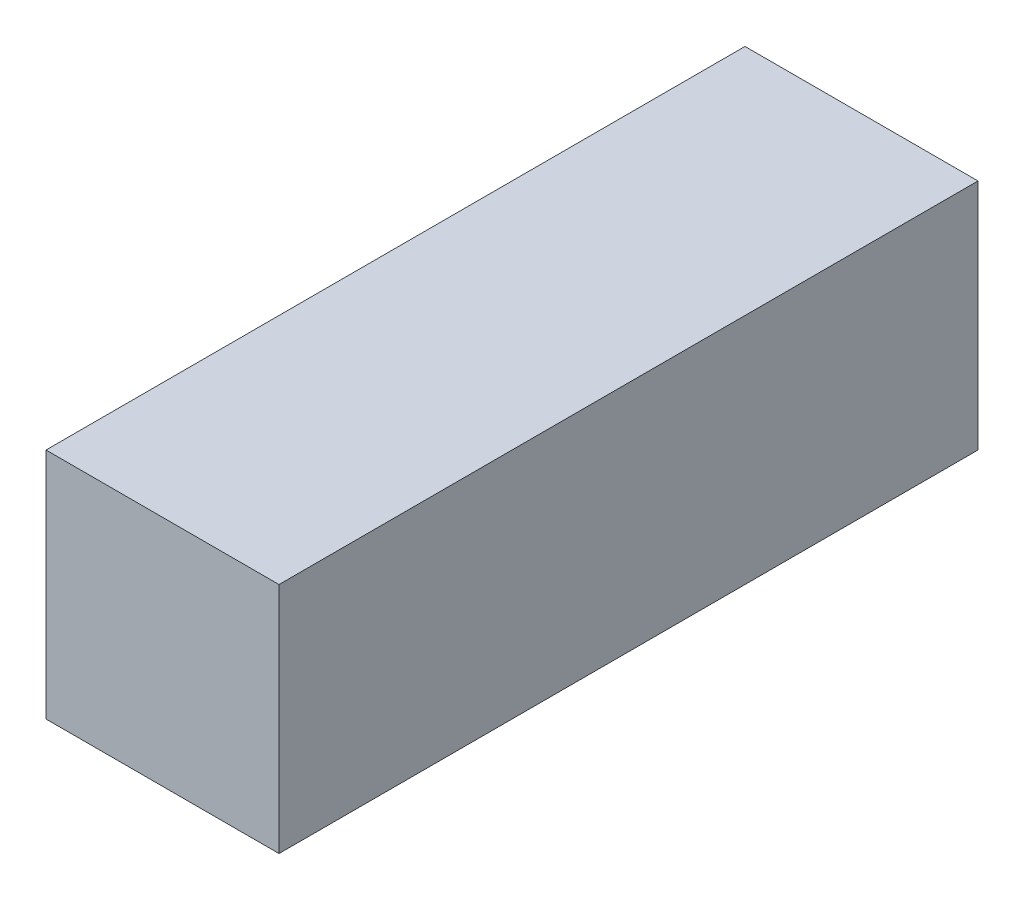
ISO-10303-21;
HEADER;
FILE_DESCRIPTION(('STEP AP214'),'2;1');
FILE_NAME('part.step','',(''),(''),'','','');
FILE_SCHEMA(('AUTOMOTIVE_DESIGN { 1 0 10303 214 1 1 1 1 }'));
ENDSEC;
DATA;
#1=APPLICATION_CONTEXT('core data for automotive mechanical design processes');
#2=APPLICATION_PROTOCOL_DEFINITION('international standard','automotive_design',2000,#1);
#3=PRODUCT_CONTEXT('',#1,'mechanical');
#4=PRODUCT('Part','Part','',(#3));
#5=PRODUCT_RELATED_PRODUCT_CATEGORY('part','',(#4));
#6=PRODUCT_DEFINITION_FORMATION('','',#4);
#7=PRODUCT_DEFINITION_CONTEXT('part definition',#1,'design');
#8=PRODUCT_DEFINITION('design','',#6,#7);
#9=PRODUCT_DEFINITION_SHAPE('','',#8);
#10=(LENGTH_UNIT() NAMED_UNIT(*) SI_UNIT(.MILLI.,.METRE.));
#11=(NAMED_UNIT(*) PLANE_ANGLE_UNIT() SI_UNIT($,.RADIAN.));
#12=(NAMED_UNIT(*) SI_UNIT($,.STERADIAN.) SOLID_ANGLE_UNIT());
#13=UNCERTAINTY_MEASURE_WITH_UNIT(LENGTH_MEASURE(1.E-05),#10,'distance_accuracy_value','');
#14=(GEOMETRIC_REPRESENTATION_CONTEXT(3) GLOBAL_UNCERTAINTY_ASSIGNED_CONTEXT((#13)) GLOBAL_UNIT_ASSIGNED_CONTEXT((#10,
#11,#12)) REPRESENTATION_CONTEXT('',''));
#15=CARTESIAN_POINT('',(0.,0.,0.));
#16=DIRECTION('',(0.,0.,1.));
#17=DIRECTION('',(1.,0.,0.));
#18=AXIS2_PLACEMENT_3D('',#15,#16,#17);
#19=CARTESIAN_POINT('',(0.,0.,12.));
#20=DIRECTION('',(0.,0.,1.));
#21=DIRECTION('',(1.,0.,0.));
#22=AXIS2_PLACEMENT_3D('',#19,#20,#21);
#23=PLANE('',#22);
#24=DIRECTION('',(-1.,0.,0.));
#25=VECTOR('',#24,1.);
#26=CARTESIAN_POINT('',(0.,-4.,12.));
#27=LINE('',#26,#25);
#28=CARTESIAN_POINT('',(4.,-4.,12.));
#29=VERTEX_POINT('',#28);
#30=CARTESIAN_POINT('',(-4.,-4.,12.));
#31=VERTEX_POINT('',#30);
#32=EDGE_CURVE('E10',#29,#31,#27,.T.);
#33=ORIENTED_EDGE('',*,*,#32,.F.);
#34=DIRECTION('',(0.,-1.,0.));
#35=VECTOR('',#34,1.);
#36=CARTESIAN_POINT('',(4.,0.,12.));
#37=LINE('',#36,#35);
#38=CARTESIAN_POINT('',(4.,4.,12.));
#39=VERTEX_POINT('',#38);
#40=EDGE_CURVE('E60',#39,#29,#37,.T.);
#41=ORIENTED_EDGE('',*,*,#40,.F.);
#42=DIRECTION('',(1.,0.,0.));
#43=VECTOR('',#42,1.);
#44=CARTESIAN_POINT('',(0.,4.,12.));
#45=LINE('',#44,#43);
#46=CARTESIAN_POINT('',(-4.,4.,12.));
#47=VERTEX_POINT('',#46);
#48=EDGE_CURVE('E86',#47,#39,#45,.T.);
#49=ORIENTED_EDGE('',*,*,#48,.F.);
#50=DIRECTION('',(0.,1.,0.));
#51=VECTOR('',#50,1.);
#52=CARTESIAN_POINT('',(-4.,0.,12.));
#53=LINE('',#52,#51);
#54=EDGE_CURVE('E23',#31,#47,#53,.T.);
#55=ORIENTED_EDGE('',*,*,#54,.F.);
#56=EDGE_LOOP('',(#33,#41,#49,#55));
#57=FACE_BOUND('',#56,.T.);
#58=ADVANCED_FACE('F16',(#57),#23,.T.);
#59=CARTESIAN_POINT('',(0.,-4.,-12.));
#60=DIRECTION('',(0.,-1.,0.));
#61=DIRECTION('',(0.,0.,-1.));
#62=AXIS2_PLACEMENT_3D('',#59,#60,#61);
#63=PLANE('',#62);
#64=DIRECTION('',(0.,0.,1.));
#65=VECTOR('',#64,1.);
#66=CARTESIAN_POINT('',(4.,-4.,-12.));
#67=LINE('',#66,#65);
#68=CARTESIAN_POINT('',(4.,-4.,-12.));
#69=VERTEX_POINT('',#68);
#70=EDGE_CURVE('E53',#69,#29,#67,.T.);
#71=ORIENTED_EDGE('',*,*,#70,.T.);
#72=ORIENTED_EDGE('',*,*,#32,.T.);
#73=DIRECTION('',(0.,0.,1.));
#74=VECTOR('',#73,1.);
#75=CARTESIAN_POINT('',(-4.,-4.,-12.));
#76=LINE('',#75,#74);
#77=CARTESIAN_POINT('',(-4.,-4.,-12.));
#78=VERTEX_POINT('',#77);
#79=EDGE_CURVE('E66',#78,#31,#76,.T.);
#80=ORIENTED_EDGE('',*,*,#79,.F.);
#81=DIRECTION('',(1.,0.,0.));
#82=VECTOR('',#81,1.);
#83=CARTESIAN_POINT('',(0.,-4.,-12.));
#84=LINE('',#83,#82);
#85=EDGE_CURVE('E64',#78,#69,#84,.T.);
#86=ORIENTED_EDGE('',*,*,#85,.T.);
#87=EDGE_LOOP('',(#71,#72,#80,#86));
#88=FACE_BOUND('',#87,.T.);
#89=ADVANCED_FACE('F65',(#88),#63,.T.);
#90=CARTESIAN_POINT('',(-4.,0.,-12.));
#91=DIRECTION('',(-1.,0.,0.));
#92=DIRECTION('',(0.,0.,1.));
#93=AXIS2_PLACEMENT_3D('',#90,#91,#92);
#94=PLANE('',#93);
#95=ORIENTED_EDGE('',*,*,#79,.T.);
#96=ORIENTED_EDGE('',*,*,#54,.T.);
#97=DIRECTION('',(0.,0.,1.));
#98=VECTOR('',#97,1.);
#99=CARTESIAN_POINT('',(-4.,4.,-12.));
#100=LINE('',#99,#98);
#101=CARTESIAN_POINT('',(-4.,4.,-12.));
#102=VERTEX_POINT('',#101);
#103=EDGE_CURVE('E81',#102,#47,#100,.T.);
#104=ORIENTED_EDGE('',*,*,#103,.F.);
#105=DIRECTION('',(0.,-1.,0.));
#106=VECTOR('',#105,1.);
#107=CARTESIAN_POINT('',(-4.,0.,-12.));
#108=LINE('',#107,#106);
#109=EDGE_CURVE('E70',#102,#78,#108,.T.);
#110=ORIENTED_EDGE('',*,*,#109,.T.);
#111=EDGE_LOOP('',(#95,#96,#104,#110));
#112=FACE_BOUND('',#111,.T.);
#113=ADVANCED_FACE('F90',(#112),#94,.T.);
#114=CARTESIAN_POINT('',(0.,4.,-12.));
#115=DIRECTION('',(0.,1.,0.));
#116=DIRECTION('',(0.,0.,1.));
#117=AXIS2_PLACEMENT_3D('',#114,#115,#116);
#118=PLANE('',#117);
#119=ORIENTED_EDGE('',*,*,#103,.T.);
#120=ORIENTED_EDGE('',*,*,#48,.T.);
#121=DIRECTION('',(0.,0.,1.));
#122=VECTOR('',#121,1.);
#123=CARTESIAN_POINT('',(4.,4.,-12.));
#124=LINE('',#123,#122);
#125=CARTESIAN_POINT('',(4.,4.,-12.));
#126=VERTEX_POINT('',#125);
#127=EDGE_CURVE('E61',#126,#39,#124,.T.);
#128=ORIENTED_EDGE('',*,*,#127,.F.);
#129=DIRECTION('',(-1.,0.,0.));
#130=VECTOR('',#129,1.);
#131=CARTESIAN_POINT('',(0.,4.,-12.));
#132=LINE('',#131,#130);
#133=EDGE_CURVE('E75',#126,#102,#132,.T.);
#134=ORIENTED_EDGE('',*,*,#133,.T.);
#135=EDGE_LOOP('',(#119,#120,#128,#134));
#136=FACE_BOUND('',#135,.T.);
#137=ADVANCED_FACE('F88',(#136),#118,.T.);
#138=CARTESIAN_POINT('',(0.,0.,-12.));
#139=DIRECTION('',(0.,0.,-1.));
#140=DIRECTION('',(-1.,0.,0.));
#141=AXIS2_PLACEMENT_3D('',#138,#139,#140);
#142=PLANE('',#141);
#143=DIRECTION('',(0.,1.,0.));
#144=VECTOR('',#143,1.);
#145=CARTESIAN_POINT('',(4.,0.,-12.));
#146=LINE('',#145,#144);
#147=EDGE_CURVE('E58',#69,#126,#146,.T.);
#148=ORIENTED_EDGE('',*,*,#147,.F.);
#149=ORIENTED_EDGE('',*,*,#85,.F.);
#150=ORIENTED_EDGE('',*,*,#109,.F.);
#151=ORIENTED_EDGE('',*,*,#133,.F.);
#152=EDGE_LOOP('',(#148,#149,#150,#151));
#153=FACE_BOUND('',#152,.T.);
#154=ADVANCED_FACE('F73',(#153),#142,.T.);
#155=CARTESIAN_POINT('',(4.,0.,-12.));
#156=DIRECTION('',(1.,0.,0.));
#157=DIRECTION('',(0.,0.,-1.));
#158=AXIS2_PLACEMENT_3D('',#155,#156,#157);
#159=PLANE('',#158);
#160=ORIENTED_EDGE('',*,*,#147,.T.);
#161=ORIENTED_EDGE('',*,*,#127,.T.);
#162=ORIENTED_EDGE('',*,*,#40,.T.);
#163=ORIENTED_EDGE('',*,*,#70,.F.);
#164=EDGE_LOOP('',(#160,#161,#162,#163));
#165=FACE_BOUND('',#164,.T.);
#166=ADVANCED_FACE('F55',(#165),#159,.T.);
#167=CLOSED_SHELL('',(#58,#89,#113,#137,#154,#166));
#168=MANIFOLD_SOLID_BREP('B1',#167);
#169=ADVANCED_BREP_SHAPE_REPRESENTATION('',(#18,#168),#14);
#170=SHAPE_DEFINITION_REPRESENTATION(#9,#169);
ENDSEC;
END-ISO-10303-21;
